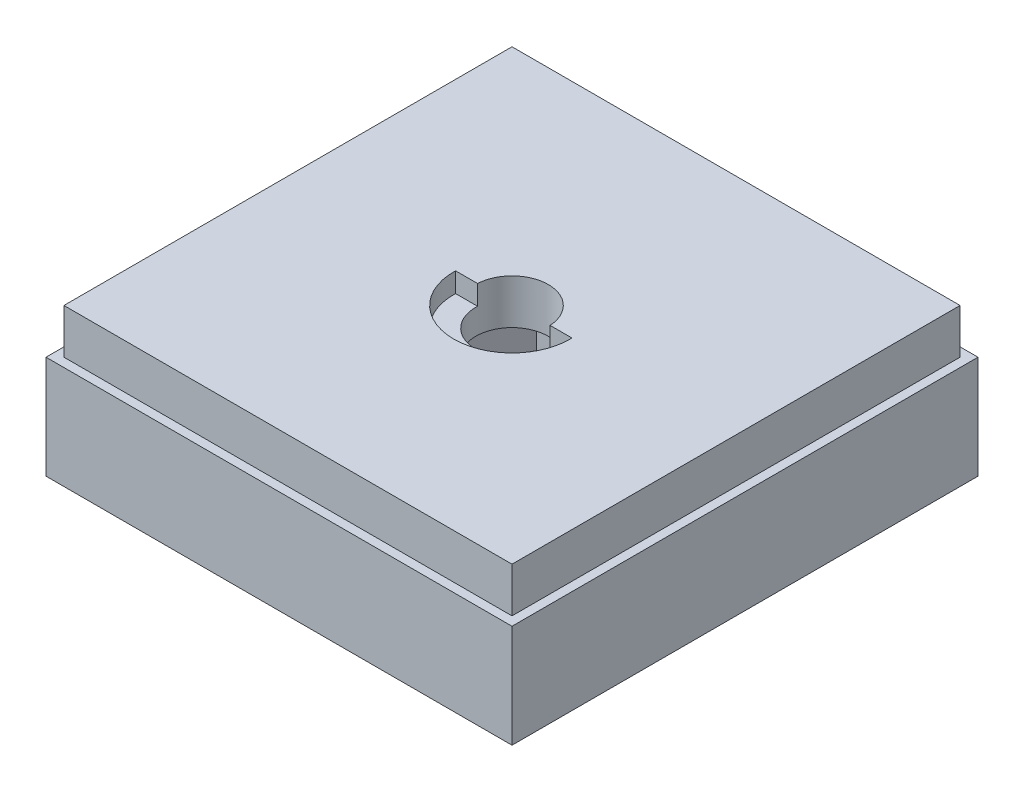
ISO-10303-21;
HEADER;
FILE_DESCRIPTION(('STEP AP214'),'2;1');
FILE_NAME('part.step','',(''),(''),'','','');
FILE_SCHEMA(('AUTOMOTIVE_DESIGN { 1 0 10303 214 1 1 1 1 }'));
ENDSEC;
DATA;
#1=APPLICATION_CONTEXT('core data for automotive mechanical design processes');
#2=APPLICATION_PROTOCOL_DEFINITION('international standard','automotive_design',2000,#1);
#3=PRODUCT_CONTEXT('',#1,'mechanical');
#4=PRODUCT('Part','Part','',(#3));
#5=PRODUCT_RELATED_PRODUCT_CATEGORY('part','',(#4));
#6=PRODUCT_DEFINITION_FORMATION('','',#4);
#7=PRODUCT_DEFINITION_CONTEXT('part definition',#1,'design');
#8=PRODUCT_DEFINITION('design','',#6,#7);
#9=PRODUCT_DEFINITION_SHAPE('','',#8);
#10=(LENGTH_UNIT() NAMED_UNIT(*) SI_UNIT(.MILLI.,.METRE.));
#11=(NAMED_UNIT(*) PLANE_ANGLE_UNIT() SI_UNIT($,.RADIAN.));
#12=(NAMED_UNIT(*) SI_UNIT($,.STERADIAN.) SOLID_ANGLE_UNIT());
#13=UNCERTAINTY_MEASURE_WITH_UNIT(LENGTH_MEASURE(1.E-05),#10,'distance_accuracy_value','');
#14=(GEOMETRIC_REPRESENTATION_CONTEXT(3) GLOBAL_UNCERTAINTY_ASSIGNED_CONTEXT((#13)) GLOBAL_UNIT_ASSIGNED_CONTEXT((#10,
#11,#12)) REPRESENTATION_CONTEXT('',''));
#15=CARTESIAN_POINT('',(0.,0.,0.));
#16=DIRECTION('',(0.,0.,1.));
#17=DIRECTION('',(1.,0.,0.));
#18=AXIS2_PLACEMENT_3D('',#15,#16,#17);
#19=CARTESIAN_POINT('',(-22.2472232502674,11.5,-19.5));
#20=DIRECTION('',(-0.866025403784438,0.,-0.5));
#21=DIRECTION('',(-0.5,0.,0.866025403784439));
#22=AXIS2_PLACEMENT_3D('',#19,#20,#21);
#23=PLANE('',#22);
#24=DIRECTION('',(0.,-1.,0.));
#25=VECTOR('',#24,1.);
#26=CARTESIAN_POINT('',(-18.4944465005349,11.5,-26.));
#27=LINE('',#26,#25);
#28=CARTESIAN_POINT('',(-18.4944465005349,11.5,-26.));
#29=VERTEX_POINT('',#28);
#30=CARTESIAN_POINT('',(-18.4944465005349,7.,-26.));
#31=VERTEX_POINT('',#30);
#32=EDGE_CURVE('E319',#29,#31,#27,.T.);
#33=ORIENTED_EDGE('',*,*,#32,.T.);
#34=DIRECTION('',(-0.5,0.,0.866025403784439));
#35=VECTOR('',#34,1.);
#36=CARTESIAN_POINT('',(-22.2472232502674,7.,-19.5));
#37=LINE('',#36,#35);
#38=CARTESIAN_POINT('',(-22.2472232502674,7.,-19.5));
#39=VERTEX_POINT('',#38);
#40=EDGE_CURVE('E218',#31,#39,#37,.T.);
#41=ORIENTED_EDGE('',*,*,#40,.T.);
#42=DIRECTION('',(0.,-1.,0.));
#43=VECTOR('',#42,1.);
#44=CARTESIAN_POINT('',(-22.2472232502674,11.5,-19.5));
#45=LINE('',#44,#43);
#46=CARTESIAN_POINT('',(-22.2472232502674,11.5,-19.5));
#47=VERTEX_POINT('',#46);
#48=EDGE_CURVE('E299',#47,#39,#45,.T.);
#49=ORIENTED_EDGE('',*,*,#48,.F.);
#50=DIRECTION('',(0.5,0.,-0.866025403784438));
#51=VECTOR('',#50,1.);
#52=CARTESIAN_POINT('',(-22.2472232502674,11.5,-19.5));
#53=LINE('',#52,#51);
#54=EDGE_CURVE('E275',#47,#29,#53,.T.);
#55=ORIENTED_EDGE('',*,*,#54,.T.);
#56=EDGE_LOOP('',(#33,#41,#49,#55));
#57=FACE_BOUND('',#56,.T.);
#58=ADVANCED_FACE('F38',(#57),#23,.T.);
#59=CARTESIAN_POINT('',(-18.4944465005349,11.5,-26.));
#60=DIRECTION('',(-0.866025403784439,0.,0.5));
#61=DIRECTION('',(0.5,0.,0.866025403784439));
#62=AXIS2_PLACEMENT_3D('',#59,#60,#61);
#63=PLANE('',#62);
#64=DIRECTION('',(0.,-1.,0.));
#65=VECTOR('',#64,1.);
#66=CARTESIAN_POINT('',(-22.2472232502674,11.5,-32.5));
#67=LINE('',#66,#65);
#68=CARTESIAN_POINT('',(-22.2472232502674,11.5,-32.5));
#69=VERTEX_POINT('',#68);
#70=CARTESIAN_POINT('',(-22.2472232502674,7.,-32.5));
#71=VERTEX_POINT('',#70);
#72=EDGE_CURVE('E315',#69,#71,#67,.T.);
#73=ORIENTED_EDGE('',*,*,#72,.T.);
#74=DIRECTION('',(0.5,0.,0.866025403784439));
#75=VECTOR('',#74,1.);
#76=CARTESIAN_POINT('',(-18.4944465005349,7.,-26.));
#77=LINE('',#76,#75);
#78=EDGE_CURVE('E214',#71,#31,#77,.T.);
#79=ORIENTED_EDGE('',*,*,#78,.T.);
#80=ORIENTED_EDGE('',*,*,#32,.F.);
#81=DIRECTION('',(-0.5,0.,-0.866025403784439));
#82=VECTOR('',#81,1.);
#83=CARTESIAN_POINT('',(-18.4944465005349,11.5,-26.));
#84=LINE('',#83,#82);
#85=EDGE_CURVE('E279',#29,#69,#84,.T.);
#86=ORIENTED_EDGE('',*,*,#85,.T.);
#87=EDGE_LOOP('',(#73,#79,#80,#86));
#88=FACE_BOUND('',#87,.T.);
#89=ADVANCED_FACE('F405',(#88),#63,.T.);
#90=CARTESIAN_POINT('',(-22.2472232502674,11.5,-32.5));
#91=DIRECTION('',(0.,0.,1.));
#92=DIRECTION('',(1.,0.,0.));
#93=AXIS2_PLACEMENT_3D('',#90,#91,#92);
#94=PLANE('',#93);
#95=DIRECTION('',(0.,-1.,0.));
#96=VECTOR('',#95,1.);
#97=CARTESIAN_POINT('',(-29.7527767497326,11.5,-32.5));
#98=LINE('',#97,#96);
#99=CARTESIAN_POINT('',(-29.7527767497326,11.5,-32.5));
#100=VERTEX_POINT('',#99);
#101=CARTESIAN_POINT('',(-29.7527767497326,7.,-32.5));
#102=VERTEX_POINT('',#101);
#103=EDGE_CURVE('E311',#100,#102,#98,.T.);
#104=ORIENTED_EDGE('',*,*,#103,.T.);
#105=DIRECTION('',(1.,0.,0.));
#106=VECTOR('',#105,1.);
#107=CARTESIAN_POINT('',(-22.2472232502674,7.,-32.5));
#108=LINE('',#107,#106);
#109=EDGE_CURVE('E210',#102,#71,#108,.T.);
#110=ORIENTED_EDGE('',*,*,#109,.T.);
#111=ORIENTED_EDGE('',*,*,#72,.F.);
#112=DIRECTION('',(-1.,0.,0.));
#113=VECTOR('',#112,1.);
#114=CARTESIAN_POINT('',(-22.2472232502674,11.5,-32.5));
#115=LINE('',#114,#113);
#116=EDGE_CURVE('E283',#69,#100,#115,.T.);
#117=ORIENTED_EDGE('',*,*,#116,.T.);
#118=EDGE_LOOP('',(#104,#110,#111,#117));
#119=FACE_BOUND('',#118,.T.);
#120=ADVANCED_FACE('F411',(#119),#94,.T.);
#121=CARTESIAN_POINT('',(-29.7527767497326,11.5,-32.5));
#122=DIRECTION('',(0.866025403784439,0.,0.5));
#123=DIRECTION('',(0.5,0.,-0.866025403784439));
#124=AXIS2_PLACEMENT_3D('',#121,#122,#123);
#125=PLANE('',#124);
#126=DIRECTION('',(0.,-1.,0.));
#127=VECTOR('',#126,1.);
#128=CARTESIAN_POINT('',(-33.5055534994651,11.5,-26.));
#129=LINE('',#128,#127);
#130=CARTESIAN_POINT('',(-33.5055534994651,11.5,-26.));
#131=VERTEX_POINT('',#130);
#132=CARTESIAN_POINT('',(-33.5055534994651,7.,-26.));
#133=VERTEX_POINT('',#132);
#134=EDGE_CURVE('E307',#131,#133,#129,.T.);
#135=ORIENTED_EDGE('',*,*,#134,.T.);
#136=DIRECTION('',(0.5,0.,-0.866025403784439));
#137=VECTOR('',#136,1.);
#138=CARTESIAN_POINT('',(-29.7527767497326,7.,-32.5));
#139=LINE('',#138,#137);
#140=EDGE_CURVE('E206',#133,#102,#139,.T.);
#141=ORIENTED_EDGE('',*,*,#140,.T.);
#142=ORIENTED_EDGE('',*,*,#103,.F.);
#143=DIRECTION('',(-0.5,0.,0.866025403784439));
#144=VECTOR('',#143,1.);
#145=CARTESIAN_POINT('',(-29.7527767497326,11.5,-32.5));
#146=LINE('',#145,#144);
#147=EDGE_CURVE('E287',#100,#131,#146,.T.);
#148=ORIENTED_EDGE('',*,*,#147,.T.);
#149=EDGE_LOOP('',(#135,#141,#142,#148));
#150=FACE_BOUND('',#149,.T.);
#151=ADVANCED_FACE('F476',(#150),#125,.T.);
#152=CARTESIAN_POINT('',(-33.5055534994651,11.5,-26.));
#153=DIRECTION('',(0.866025403784439,0.,-0.5));
#154=DIRECTION('',(-0.5,0.,-0.866025403784439));
#155=AXIS2_PLACEMENT_3D('',#152,#153,#154);
#156=PLANE('',#155);
#157=DIRECTION('',(0.,-1.,0.));
#158=VECTOR('',#157,1.);
#159=CARTESIAN_POINT('',(-29.7527767497326,11.5,-19.5));
#160=LINE('',#159,#158);
#161=CARTESIAN_POINT('',(-29.7527767497326,11.5,-19.5));
#162=VERTEX_POINT('',#161);
#163=CARTESIAN_POINT('',(-29.7527767497326,7.,-19.5));
#164=VERTEX_POINT('',#163);
#165=EDGE_CURVE('E303',#162,#164,#160,.T.);
#166=ORIENTED_EDGE('',*,*,#165,.T.);
#167=DIRECTION('',(-0.5,0.,-0.866025403784439));
#168=VECTOR('',#167,1.);
#169=CARTESIAN_POINT('',(-33.5055534994651,7.,-26.));
#170=LINE('',#169,#168);
#171=EDGE_CURVE('E61',#164,#133,#170,.T.);
#172=ORIENTED_EDGE('',*,*,#171,.T.);
#173=ORIENTED_EDGE('',*,*,#134,.F.);
#174=DIRECTION('',(0.5,0.,0.866025403784439));
#175=VECTOR('',#174,1.);
#176=CARTESIAN_POINT('',(-33.5055534994651,11.5,-26.));
#177=LINE('',#176,#175);
#178=EDGE_CURVE('E291',#131,#162,#177,.T.);
#179=ORIENTED_EDGE('',*,*,#178,.T.);
#180=EDGE_LOOP('',(#166,#172,#173,#179));
#181=FACE_BOUND('',#180,.T.);
#182=ADVANCED_FACE('F468',(#181),#156,.T.);
#183=CARTESIAN_POINT('',(-29.7527767497326,11.5,-19.5));
#184=DIRECTION('',(0.,0.,-1.));
#185=DIRECTION('',(-1.,0.,0.));
#186=AXIS2_PLACEMENT_3D('',#183,#184,#185);
#187=PLANE('',#186);
#188=ORIENTED_EDGE('',*,*,#48,.T.);
#189=DIRECTION('',(-1.,0.,0.));
#190=VECTOR('',#189,1.);
#191=CARTESIAN_POINT('',(-29.7527767497326,7.,-19.5));
#192=LINE('',#191,#190);
#193=EDGE_CURVE('E365',#39,#164,#192,.T.);
#194=ORIENTED_EDGE('',*,*,#193,.T.);
#195=ORIENTED_EDGE('',*,*,#165,.F.);
#196=DIRECTION('',(1.,0.,0.));
#197=VECTOR('',#196,1.);
#198=CARTESIAN_POINT('',(-29.7527767497326,11.5,-19.5));
#199=LINE('',#198,#197);
#200=EDGE_CURVE('E295',#162,#47,#199,.T.);
#201=ORIENTED_EDGE('',*,*,#200,.T.);
#202=EDGE_LOOP('',(#188,#194,#195,#201));
#203=FACE_BOUND('',#202,.T.);
#204=ADVANCED_FACE('F420',(#203),#187,.T.);
#205=CARTESIAN_POINT('',(0.,11.5,0.));
#206=DIRECTION('',(0.,1.,0.));
#207=DIRECTION('',(0.,0.,1.));
#208=AXIS2_PLACEMENT_3D('',#205,#206,#207);
#209=PLANE('',#208);
#210=DIRECTION('',(-1.,0.,0.));
#211=VECTOR('',#210,1.);
#212=CARTESIAN_POINT('',(-1.,11.5,-51.));
#213=LINE('',#212,#211);
#214=CARTESIAN_POINT('',(-1.,11.5,-51.));
#215=VERTEX_POINT('',#214);
#216=CARTESIAN_POINT('',(-51.,11.5,-51.));
#217=VERTEX_POINT('',#216);
#218=EDGE_CURVE('E227',#215,#217,#213,.T.);
#219=ORIENTED_EDGE('',*,*,#218,.F.);
#220=DIRECTION('',(0.,0.,-1.));
#221=VECTOR('',#220,1.);
#222=CARTESIAN_POINT('',(-1.,11.5,-1.));
#223=LINE('',#222,#221);
#224=CARTESIAN_POINT('',(-1.,11.5,-1.));
#225=VERTEX_POINT('',#224);
#226=EDGE_CURVE('E236',#225,#215,#223,.T.);
#227=ORIENTED_EDGE('',*,*,#226,.F.);
#228=DIRECTION('',(1.,0.,0.));
#229=VECTOR('',#228,1.);
#230=CARTESIAN_POINT('',(-51.,11.5,-1.));
#231=LINE('',#230,#229);
#232=CARTESIAN_POINT('',(-51.,11.5,-1.));
#233=VERTEX_POINT('',#232);
#234=EDGE_CURVE('E253',#233,#225,#231,.T.);
#235=ORIENTED_EDGE('',*,*,#234,.F.);
#236=DIRECTION('',(0.,0.,1.));
#237=VECTOR('',#236,1.);
#238=CARTESIAN_POINT('',(-51.,11.5,-51.));
#239=LINE('',#238,#237);
#240=EDGE_CURVE('E249',#217,#233,#239,.T.);
#241=ORIENTED_EDGE('',*,*,#240,.F.);
#242=EDGE_LOOP('',(#219,#227,#235,#241));
#243=FACE_BOUND('',#242,.T.);
#244=DIRECTION('',(0.,0.,1.));
#245=VECTOR('',#244,1.);
#246=CARTESIAN_POINT('',(-52.,11.5,-52.));
#247=LINE('',#246,#245);
#248=CARTESIAN_POINT('',(-52.,11.5,-52.));
#249=VERTEX_POINT('',#248);
#250=CARTESIAN_POINT('',(-52.,11.5,0.));
#251=VERTEX_POINT('',#250);
#252=EDGE_CURVE('E324',#249,#251,#247,.T.);
#253=ORIENTED_EDGE('',*,*,#252,.T.);
#254=DIRECTION('',(1.,0.,0.));
#255=VECTOR('',#254,1.);
#256=CARTESIAN_POINT('',(-52.,11.5,0.));
#257=LINE('',#256,#255);
#258=CARTESIAN_POINT('',(0.,11.5,0.));
#259=VERTEX_POINT('',#258);
#260=EDGE_CURVE('E328',#251,#259,#257,.T.);
#261=ORIENTED_EDGE('',*,*,#260,.T.);
#262=DIRECTION('',(0.,0.,-1.));
#263=VECTOR('',#262,1.);
#264=CARTESIAN_POINT('',(0.,11.5,-52.));
#265=LINE('',#264,#263);
#266=CARTESIAN_POINT('',(0.,11.5,-52.));
#267=VERTEX_POINT('',#266);
#268=EDGE_CURVE('E332',#259,#267,#265,.T.);
#269=ORIENTED_EDGE('',*,*,#268,.T.);
#270=DIRECTION('',(-1.,0.,0.));
#271=VECTOR('',#270,1.);
#272=CARTESIAN_POINT('',(-52.,11.5,-52.));
#273=LINE('',#272,#271);
#274=EDGE_CURVE('E335',#267,#249,#273,.T.);
#275=ORIENTED_EDGE('',*,*,#274,.T.);
#276=EDGE_LOOP('',(#253,#261,#269,#275));
#277=FACE_BOUND('',#276,.T.);
#278=ADVANCED_FACE('F416',(#243,#277),#209,.T.);
#279=CARTESIAN_POINT('',(0.,0.,0.));
#280=DIRECTION('',(0.,1.,0.));
#281=DIRECTION('',(0.,0.,1.));
#282=AXIS2_PLACEMENT_3D('',#279,#280,#281);
#283=PLANE('',#282);
#284=CARTESIAN_POINT('',(-26.,0.,-26.));
#285=DIRECTION('',(0.,-1.,0.));
#286=DIRECTION('',(0.,0.,-1.));
#287=AXIS2_PLACEMENT_3D('',#284,#285,#286);
#288=CIRCLE('',#287,8.);
#289=CARTESIAN_POINT('',(-26.,0.,-34.));
#290=VERTEX_POINT('',#289);
#291=EDGE_CURVE('E195',#290,#290,#288,.T.);
#292=ORIENTED_EDGE('',*,*,#291,.F.);
#293=EDGE_LOOP('',(#292));
#294=FACE_BOUND('',#293,.T.);
#295=DIRECTION('',(0.,0.,1.));
#296=VECTOR('',#295,1.);
#297=CARTESIAN_POINT('',(-52.,0.,-52.));
#298=LINE('',#297,#296);
#299=CARTESIAN_POINT('',(-52.,0.,-52.));
#300=VERTEX_POINT('',#299);
#301=CARTESIAN_POINT('',(-52.,0.,0.));
#302=VERTEX_POINT('',#301);
#303=EDGE_CURVE('E323',#300,#302,#298,.T.);
#304=ORIENTED_EDGE('',*,*,#303,.F.);
#305=DIRECTION('',(-1.,0.,0.));
#306=VECTOR('',#305,1.);
#307=CARTESIAN_POINT('',(-52.,0.,-52.));
#308=LINE('',#307,#306);
#309=CARTESIAN_POINT('',(0.,0.,-52.));
#310=VERTEX_POINT('',#309);
#311=EDGE_CURVE('E329',#310,#300,#308,.T.);
#312=ORIENTED_EDGE('',*,*,#311,.F.);
#313=DIRECTION('',(0.,0.,-1.));
#314=VECTOR('',#313,1.);
#315=CARTESIAN_POINT('',(0.,0.,-52.));
#316=LINE('',#315,#314);
#317=CARTESIAN_POINT('',(0.,0.,0.));
#318=VERTEX_POINT('',#317);
#319=EDGE_CURVE('E345',#318,#310,#316,.T.);
#320=ORIENTED_EDGE('',*,*,#319,.F.);
#321=DIRECTION('',(1.,0.,0.));
#322=VECTOR('',#321,1.);
#323=CARTESIAN_POINT('',(-52.,0.,0.));
#324=LINE('',#323,#322);
#325=EDGE_CURVE('E342',#302,#318,#324,.T.);
#326=ORIENTED_EDGE('',*,*,#325,.F.);
#327=EDGE_LOOP('',(#304,#312,#320,#326));
#328=FACE_BOUND('',#327,.T.);
#329=ADVANCED_FACE('F419',(#294,#328),#283,.F.);
#330=CARTESIAN_POINT('',(-52.,11.5,-52.));
#331=DIRECTION('',(1.,0.,0.));
#332=DIRECTION('',(0.,0.,-1.));
#333=AXIS2_PLACEMENT_3D('',#330,#331,#332);
#334=PLANE('',#333);
#335=ORIENTED_EDGE('',*,*,#303,.T.);
#336=DIRECTION('',(0.,-1.,0.));
#337=VECTOR('',#336,1.);
#338=CARTESIAN_POINT('',(-52.,11.5,0.));
#339=LINE('',#338,#337);
#340=EDGE_CURVE('E361',#251,#302,#339,.T.);
#341=ORIENTED_EDGE('',*,*,#340,.F.);
#342=ORIENTED_EDGE('',*,*,#252,.F.);
#343=DIRECTION('',(0.,-1.,0.));
#344=VECTOR('',#343,1.);
#345=CARTESIAN_POINT('',(-52.,11.5,-52.));
#346=LINE('',#345,#344);
#347=EDGE_CURVE('E338',#249,#300,#346,.T.);
#348=ORIENTED_EDGE('',*,*,#347,.T.);
#349=EDGE_LOOP('',(#335,#341,#342,#348));
#350=FACE_BOUND('',#349,.T.);
#351=ADVANCED_FACE('F40',(#350),#334,.F.);
#352=CARTESIAN_POINT('',(-52.,11.5,0.));
#353=DIRECTION('',(0.,0.,-1.));
#354=DIRECTION('',(-1.,0.,0.));
#355=AXIS2_PLACEMENT_3D('',#352,#353,#354);
#356=PLANE('',#355);
#357=ORIENTED_EDGE('',*,*,#325,.T.);
#358=DIRECTION('',(0.,-1.,0.));
#359=VECTOR('',#358,1.);
#360=CARTESIAN_POINT('',(0.,11.5,0.));
#361=LINE('',#360,#359);
#362=EDGE_CURVE('E357',#259,#318,#361,.T.);
#363=ORIENTED_EDGE('',*,*,#362,.F.);
#364=ORIENTED_EDGE('',*,*,#260,.F.);
#365=ORIENTED_EDGE('',*,*,#340,.T.);
#366=EDGE_LOOP('',(#357,#363,#364,#365));
#367=FACE_BOUND('',#366,.T.);
#368=ADVANCED_FACE('F430',(#367),#356,.F.);
#369=CARTESIAN_POINT('',(0.,11.5,-52.));
#370=DIRECTION('',(-1.,0.,0.));
#371=DIRECTION('',(0.,0.,1.));
#372=AXIS2_PLACEMENT_3D('',#369,#370,#371);
#373=PLANE('',#372);
#374=ORIENTED_EDGE('',*,*,#319,.T.);
#375=DIRECTION('',(0.,-1.,0.));
#376=VECTOR('',#375,1.);
#377=CARTESIAN_POINT('',(0.,11.5,-52.));
#378=LINE('',#377,#376);
#379=EDGE_CURVE('E353',#267,#310,#378,.T.);
#380=ORIENTED_EDGE('',*,*,#379,.F.);
#381=ORIENTED_EDGE('',*,*,#268,.F.);
#382=ORIENTED_EDGE('',*,*,#362,.T.);
#383=EDGE_LOOP('',(#374,#380,#381,#382));
#384=FACE_BOUND('',#383,.T.);
#385=ADVANCED_FACE('F427',(#384),#373,.F.);
#386=CARTESIAN_POINT('',(-52.,11.5,-52.));
#387=DIRECTION('',(0.,0.,1.));
#388=DIRECTION('',(1.,0.,0.));
#389=AXIS2_PLACEMENT_3D('',#386,#387,#388);
#390=PLANE('',#389);
#391=ORIENTED_EDGE('',*,*,#311,.T.);
#392=ORIENTED_EDGE('',*,*,#347,.F.);
#393=ORIENTED_EDGE('',*,*,#274,.F.);
#394=ORIENTED_EDGE('',*,*,#379,.T.);
#395=EDGE_LOOP('',(#391,#392,#393,#394));
#396=FACE_BOUND('',#395,.T.);
#397=ADVANCED_FACE('F401',(#396),#390,.F.);
#398=CARTESIAN_POINT('',(0.,16.5,0.));
#399=DIRECTION('',(0.,1.,0.));
#400=DIRECTION('',(0.,0.,1.));
#401=AXIS2_PLACEMENT_3D('',#398,#399,#400);
#402=PLANE('',#401);
#403=DIRECTION('',(-1.,0.,0.));
#404=VECTOR('',#403,1.);
#405=CARTESIAN_POINT('',(-32.4969223483123,16.5,-26.2));
#406=LINE('',#405,#404);
#407=CARTESIAN_POINT('',(-19.5030776516877,16.5,-26.2));
#408=VERTEX_POINT('',#407);
#409=CARTESIAN_POINT('',(-21.9549412859638,16.5,-26.2));
#410=VERTEX_POINT('',#409);
#411=EDGE_CURVE('E180',#408,#410,#406,.T.);
#412=ORIENTED_EDGE('',*,*,#411,.F.);
#413=CARTESIAN_POINT('',(-26.,16.5,-26.));
#414=DIRECTION('',(0.,1.,0.));
#415=DIRECTION('',(0.,0.,1.));
#416=AXIS2_PLACEMENT_3D('',#413,#414,#415);
#417=CIRCLE('',#416,6.5);
#418=CARTESIAN_POINT('',(-32.4969223483123,16.5,-26.2));
#419=VERTEX_POINT('',#418);
#420=EDGE_CURVE('E169',#419,#408,#417,.T.);
#421=ORIENTED_EDGE('',*,*,#420,.F.);
#422=CARTESIAN_POINT('',(-30.0450587140362,16.5,-26.2));
#423=VERTEX_POINT('',#422);
#424=EDGE_CURVE('E191',#423,#419,#406,.T.);
#425=ORIENTED_EDGE('',*,*,#424,.F.);
#426=CARTESIAN_POINT('',(-26.,16.5,-26.));
#427=DIRECTION('',(0.,1.,0.));
#428=DIRECTION('',(0.,0.,1.));
#429=AXIS2_PLACEMENT_3D('',#426,#427,#428);
#430=CIRCLE('',#429,4.05);
#431=EDGE_CURVE('E223',#410,#423,#430,.T.);
#432=ORIENTED_EDGE('',*,*,#431,.F.);
#433=EDGE_LOOP('',(#412,#421,#425,#432));
#434=FACE_BOUND('',#433,.T.);
#435=DIRECTION('',(-1.,0.,0.));
#436=VECTOR('',#435,1.);
#437=CARTESIAN_POINT('',(-1.,16.5,-51.));
#438=LINE('',#437,#436);
#439=CARTESIAN_POINT('',(-1.,16.5,-51.));
#440=VERTEX_POINT('',#439);
#441=CARTESIAN_POINT('',(-51.,16.5,-51.));
#442=VERTEX_POINT('',#441);
#443=EDGE_CURVE('E231',#440,#442,#438,.T.);
#444=ORIENTED_EDGE('',*,*,#443,.T.);
#445=DIRECTION('',(0.,0.,1.));
#446=VECTOR('',#445,1.);
#447=CARTESIAN_POINT('',(-51.,16.5,-51.));
#448=LINE('',#447,#446);
#449=CARTESIAN_POINT('',(-51.,16.5,-1.));
#450=VERTEX_POINT('',#449);
#451=EDGE_CURVE('E235',#442,#450,#448,.T.);
#452=ORIENTED_EDGE('',*,*,#451,.T.);
#453=DIRECTION('',(1.,0.,0.));
#454=VECTOR('',#453,1.);
#455=CARTESIAN_POINT('',(-51.,16.5,-1.));
#456=LINE('',#455,#454);
#457=CARTESIAN_POINT('',(-1.,16.5,-1.));
#458=VERTEX_POINT('',#457);
#459=EDGE_CURVE('E239',#450,#458,#456,.T.);
#460=ORIENTED_EDGE('',*,*,#459,.T.);
#461=DIRECTION('',(0.,0.,-1.));
#462=VECTOR('',#461,1.);
#463=CARTESIAN_POINT('',(-1.,16.5,-1.));
#464=LINE('',#463,#462);
#465=EDGE_CURVE('E242',#458,#440,#464,.T.);
#466=ORIENTED_EDGE('',*,*,#465,.T.);
#467=EDGE_LOOP('',(#444,#452,#460,#466));
#468=FACE_BOUND('',#467,.T.);
#469=ADVANCED_FACE('F378',(#434,#468),#402,.T.);
#470=CARTESIAN_POINT('',(0.,11.5,0.));
#471=DIRECTION('',(0.,1.,0.));
#472=DIRECTION('',(0.,0.,1.));
#473=AXIS2_PLACEMENT_3D('',#470,#471,#472);
#474=PLANE('',#473);
#475=ORIENTED_EDGE('',*,*,#85,.F.);
#476=ORIENTED_EDGE('',*,*,#54,.F.);
#477=ORIENTED_EDGE('',*,*,#200,.F.);
#478=ORIENTED_EDGE('',*,*,#178,.F.);
#479=ORIENTED_EDGE('',*,*,#147,.F.);
#480=ORIENTED_EDGE('',*,*,#116,.F.);
#481=EDGE_LOOP('',(#475,#476,#477,#478,#479,#480));
#482=FACE_BOUND('',#481,.T.);
#483=CARTESIAN_POINT('',(-26.,11.5,-26.));
#484=DIRECTION('',(0.,1.,0.));
#485=DIRECTION('',(0.,0.,1.));
#486=AXIS2_PLACEMENT_3D('',#483,#484,#485);
#487=CIRCLE('',#486,4.05);
#488=CARTESIAN_POINT('',(-26.,11.5,-21.95));
#489=VERTEX_POINT('',#488);
#490=EDGE_CURVE('E222',#489,#489,#487,.T.);
#491=ORIENTED_EDGE('',*,*,#490,.T.);
#492=EDGE_LOOP('',(#491));
#493=FACE_BOUND('',#492,.T.);
#494=ADVANCED_FACE('F389',(#482,#493),#474,.F.);
#495=CARTESIAN_POINT('',(-1.,16.5,-51.));
#496=DIRECTION('',(0.,0.,1.));
#497=DIRECTION('',(1.,0.,0.));
#498=AXIS2_PLACEMENT_3D('',#495,#496,#497);
#499=PLANE('',#498);
#500=ORIENTED_EDGE('',*,*,#218,.T.);
#501=DIRECTION('',(0.,-1.,0.));
#502=VECTOR('',#501,1.);
#503=CARTESIAN_POINT('',(-51.,16.5,-51.));
#504=LINE('',#503,#502);
#505=EDGE_CURVE('E271',#442,#217,#504,.T.);
#506=ORIENTED_EDGE('',*,*,#505,.F.);
#507=ORIENTED_EDGE('',*,*,#443,.F.);
#508=DIRECTION('',(0.,-1.,0.));
#509=VECTOR('',#508,1.);
#510=CARTESIAN_POINT('',(-1.,16.5,-51.));
#511=LINE('',#510,#509);
#512=EDGE_CURVE('E245',#440,#215,#511,.T.);
#513=ORIENTED_EDGE('',*,*,#512,.T.);
#514=EDGE_LOOP('',(#500,#506,#507,#513));
#515=FACE_BOUND('',#514,.T.);
#516=ADVANCED_FACE('F391',(#515),#499,.F.);
#517=CARTESIAN_POINT('',(-51.,16.5,-51.));
#518=DIRECTION('',(1.,0.,0.));
#519=DIRECTION('',(0.,0.,-1.));
#520=AXIS2_PLACEMENT_3D('',#517,#518,#519);
#521=PLANE('',#520);
#522=ORIENTED_EDGE('',*,*,#240,.T.);
#523=DIRECTION('',(0.,-1.,0.));
#524=VECTOR('',#523,1.);
#525=CARTESIAN_POINT('',(-51.,16.5,-1.));
#526=LINE('',#525,#524);
#527=EDGE_CURVE('E267',#450,#233,#526,.T.);
#528=ORIENTED_EDGE('',*,*,#527,.F.);
#529=ORIENTED_EDGE('',*,*,#451,.F.);
#530=ORIENTED_EDGE('',*,*,#505,.T.);
#531=EDGE_LOOP('',(#522,#528,#529,#530));
#532=FACE_BOUND('',#531,.T.);
#533=ADVANCED_FACE('F398',(#532),#521,.F.);
#534=CARTESIAN_POINT('',(-51.,16.5,-1.));
#535=DIRECTION('',(0.,0.,-1.));
#536=DIRECTION('',(-1.,0.,0.));
#537=AXIS2_PLACEMENT_3D('',#534,#535,#536);
#538=PLANE('',#537);
#539=ORIENTED_EDGE('',*,*,#234,.T.);
#540=DIRECTION('',(0.,-1.,0.));
#541=VECTOR('',#540,1.);
#542=CARTESIAN_POINT('',(-1.,16.5,-1.));
#543=LINE('',#542,#541);
#544=EDGE_CURVE('E263',#458,#225,#543,.T.);
#545=ORIENTED_EDGE('',*,*,#544,.F.);
#546=ORIENTED_EDGE('',*,*,#459,.F.);
#547=ORIENTED_EDGE('',*,*,#527,.T.);
#548=EDGE_LOOP('',(#539,#545,#546,#547));
#549=FACE_BOUND('',#548,.T.);
#550=ADVANCED_FACE('F509',(#549),#538,.F.);
#551=CARTESIAN_POINT('',(-1.,16.5,-1.));
#552=DIRECTION('',(-1.,0.,0.));
#553=DIRECTION('',(0.,0.,1.));
#554=AXIS2_PLACEMENT_3D('',#551,#552,#553);
#555=PLANE('',#554);
#556=ORIENTED_EDGE('',*,*,#226,.T.);
#557=ORIENTED_EDGE('',*,*,#512,.F.);
#558=ORIENTED_EDGE('',*,*,#465,.F.);
#559=ORIENTED_EDGE('',*,*,#544,.T.);
#560=EDGE_LOOP('',(#556,#557,#558,#559));
#561=FACE_BOUND('',#560,.T.);
#562=ADVANCED_FACE('F385',(#561),#555,.F.);
#563=CARTESIAN_POINT('',(-26.,16.5,-26.));
#564=DIRECTION('',(0.,-1.,0.));
#565=DIRECTION('',(0.,0.,-1.));
#566=AXIS2_PLACEMENT_3D('',#563,#564,#565);
#567=CYLINDRICAL_SURFACE('',#566,4.05);
#568=DIRECTION('',(0.,-1.,0.));
#569=VECTOR('',#568,1.);
#570=CARTESIAN_POINT('',(-21.9549412859638,16.5,-26.2));
#571=LINE('',#570,#569);
#572=CARTESIAN_POINT('',(-21.9549412859638,14.3,-26.2));
#573=VERTEX_POINT('',#572);
#574=EDGE_CURVE('E11',#410,#573,#571,.T.);
#575=ORIENTED_EDGE('',*,*,#574,.F.);
#576=ORIENTED_EDGE('',*,*,#431,.T.);
#577=DIRECTION('',(0.,-1.,0.));
#578=VECTOR('',#577,1.);
#579=CARTESIAN_POINT('',(-30.0450587140362,16.5,-26.2));
#580=LINE('',#579,#578);
#581=CARTESIAN_POINT('',(-30.0450587140362,14.3,-26.2));
#582=VERTEX_POINT('',#581);
#583=EDGE_CURVE('E47',#582,#423,#580,.F.);
#584=ORIENTED_EDGE('',*,*,#583,.F.);
#585=CARTESIAN_POINT('',(-26.,14.3,-26.));
#586=DIRECTION('',(0.,1.,0.));
#587=DIRECTION('',(0.,0.,1.));
#588=AXIS2_PLACEMENT_3D('',#585,#586,#587);
#589=CIRCLE('',#588,4.05);
#590=EDGE_CURVE('E368',#582,#573,#589,.T.);
#591=ORIENTED_EDGE('',*,*,#590,.T.);
#592=EDGE_LOOP('',(#575,#576,#584,#591));
#593=FACE_BOUND('',#592,.T.);
#594=ORIENTED_EDGE('',*,*,#490,.F.);
#595=EDGE_LOOP('',(#594));
#596=FACE_BOUND('',#595,.T.);
#597=ADVANCED_FACE('F381',(#593,#596),#567,.F.);
#598=CARTESIAN_POINT('',(-26.,7.,-26.));
#599=DIRECTION('',(0.,-1.,0.));
#600=DIRECTION('',(0.,0.,-1.));
#601=AXIS2_PLACEMENT_3D('',#598,#599,#600);
#602=CYLINDRICAL_SURFACE('',#601,8.);
#603=CARTESIAN_POINT('',(-26.,7.,-26.));
#604=DIRECTION('',(0.,-1.,0.));
#605=DIRECTION('',(0.,0.,-1.));
#606=AXIS2_PLACEMENT_3D('',#603,#604,#605);
#607=CIRCLE('',#606,8.);
#608=CARTESIAN_POINT('',(-26.,7.,-34.));
#609=VERTEX_POINT('',#608);
#610=EDGE_CURVE('E197',#609,#609,#607,.T.);
#611=ORIENTED_EDGE('',*,*,#610,.F.);
#612=EDGE_LOOP('',(#611));
#613=FACE_BOUND('',#612,.T.);
#614=ORIENTED_EDGE('',*,*,#291,.T.);
#615=EDGE_LOOP('',(#614));
#616=FACE_BOUND('',#615,.T.);
#617=ADVANCED_FACE('F384',(#613,#616),#602,.F.);
#618=CARTESIAN_POINT('',(-26.,7.,-26.));
#619=DIRECTION('',(0.,-1.,0.));
#620=DIRECTION('',(0.,0.,-1.));
#621=AXIS2_PLACEMENT_3D('',#618,#619,#620);
#622=PLANE('',#621);
#623=ORIENTED_EDGE('',*,*,#78,.F.);
#624=ORIENTED_EDGE('',*,*,#109,.F.);
#625=ORIENTED_EDGE('',*,*,#140,.F.);
#626=ORIENTED_EDGE('',*,*,#171,.F.);
#627=ORIENTED_EDGE('',*,*,#193,.F.);
#628=ORIENTED_EDGE('',*,*,#40,.F.);
#629=EDGE_LOOP('',(#623,#624,#625,#626,#627,#628));
#630=FACE_BOUND('',#629,.T.);
#631=ORIENTED_EDGE('',*,*,#610,.T.);
#632=EDGE_LOOP('',(#631));
#633=FACE_BOUND('',#632,.T.);
#634=ADVANCED_FACE('F571',(#630,#633),#622,.T.);
#635=CARTESIAN_POINT('',(-32.4969223483123,14.3,-26.2));
#636=DIRECTION('',(0.,0.,-1.));
#637=DIRECTION('',(-1.,0.,0.));
#638=AXIS2_PLACEMENT_3D('',#635,#636,#637);
#639=PLANE('',#638);
#640=ORIENTED_EDGE('',*,*,#574,.T.);
#641=DIRECTION('',(-1.,0.,0.));
#642=VECTOR('',#641,1.);
#643=CARTESIAN_POINT('',(-32.4969223483123,14.3,-26.2));
#644=LINE('',#643,#642);
#645=CARTESIAN_POINT('',(-19.5030776516877,14.3,-26.2));
#646=VERTEX_POINT('',#645);
#647=EDGE_CURVE('E54',#646,#573,#644,.T.);
#648=ORIENTED_EDGE('',*,*,#647,.F.);
#649=DIRECTION('',(0.,1.,0.));
#650=VECTOR('',#649,1.);
#651=CARTESIAN_POINT('',(-19.5030776516877,14.3,-26.2));
#652=LINE('',#651,#650);
#653=EDGE_CURVE('E164',#646,#408,#652,.T.);
#654=ORIENTED_EDGE('',*,*,#653,.T.);
#655=ORIENTED_EDGE('',*,*,#411,.T.);
#656=EDGE_LOOP('',(#640,#648,#654,#655));
#657=FACE_BOUND('',#656,.T.);
#658=ADVANCED_FACE('F182',(#657),#639,.F.);
#659=CARTESIAN_POINT('',(-26.,14.3,-26.));
#660=DIRECTION('',(0.,1.,0.));
#661=DIRECTION('',(0.,0.,1.));
#662=AXIS2_PLACEMENT_3D('',#659,#660,#661);
#663=CYLINDRICAL_SURFACE('',#662,6.5);
#664=ORIENTED_EDGE('',*,*,#420,.T.);
#665=ORIENTED_EDGE('',*,*,#653,.F.);
#666=CARTESIAN_POINT('',(-26.,14.3,-26.));
#667=DIRECTION('',(0.,1.,0.));
#668=DIRECTION('',(0.,0.,1.));
#669=AXIS2_PLACEMENT_3D('',#666,#667,#668);
#670=CIRCLE('',#669,6.5);
#671=CARTESIAN_POINT('',(-32.4969223483123,14.3,-26.2));
#672=VERTEX_POINT('',#671);
#673=EDGE_CURVE('E167',#672,#646,#670,.T.);
#674=ORIENTED_EDGE('',*,*,#673,.F.);
#675=DIRECTION('',(0.,1.,0.));
#676=VECTOR('',#675,1.);
#677=CARTESIAN_POINT('',(-32.4969223483123,14.3,-26.2));
#678=LINE('',#677,#676);
#679=EDGE_CURVE('E173',#672,#419,#678,.T.);
#680=ORIENTED_EDGE('',*,*,#679,.T.);
#681=EDGE_LOOP('',(#664,#665,#674,#680));
#682=FACE_BOUND('',#681,.T.);
#683=ADVANCED_FACE('F165',(#682),#663,.F.);
#684=ORIENTED_EDGE('',*,*,#583,.T.);
#685=ORIENTED_EDGE('',*,*,#424,.T.);
#686=ORIENTED_EDGE('',*,*,#679,.F.);
#687=EDGE_CURVE('E177',#582,#672,#644,.T.);
#688=ORIENTED_EDGE('',*,*,#687,.F.);
#689=EDGE_LOOP('',(#684,#685,#686,#688));
#690=FACE_BOUND('',#689,.T.);
#691=ADVANCED_FACE('F374',(#690),#639,.F.);
#692=CARTESIAN_POINT('',(-26.,14.3,-26.));
#693=DIRECTION('',(0.,1.,0.));
#694=DIRECTION('',(0.,0.,1.));
#695=AXIS2_PLACEMENT_3D('',#692,#693,#694);
#696=PLANE('',#695);
#697=ORIENTED_EDGE('',*,*,#687,.T.);
#698=ORIENTED_EDGE('',*,*,#673,.T.);
#699=ORIENTED_EDGE('',*,*,#647,.T.);
#700=ORIENTED_EDGE('',*,*,#590,.F.);
#701=EDGE_LOOP('',(#697,#698,#699,#700));
#702=FACE_BOUND('',#701,.T.);
#703=ADVANCED_FACE('F175',(#702),#696,.T.);
#704=CLOSED_SHELL('',(#58,#89,#120,#151,#182,#204,#278,#329,#351,#368,#385,#397,#469,#494,#516,
#533,#550,#562,#597,#617,#634,#658,#683,#691,#703));
#705=MANIFOLD_SOLID_BREP('B2',#704);
#706=ADVANCED_BREP_SHAPE_REPRESENTATION('',(#18,#705),#14);
#707=SHAPE_DEFINITION_REPRESENTATION(#9,#706);
ENDSEC;
END-ISO-10303-21;
